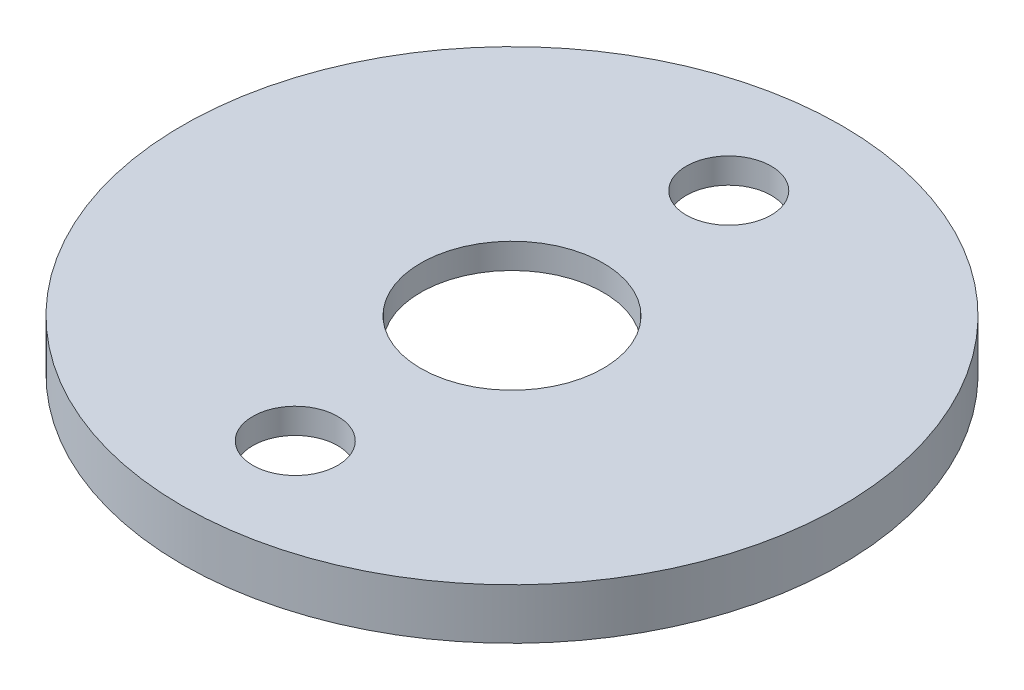
ISO-10303-21;
HEADER;
FILE_DESCRIPTION(('STEP AP214'),'2;1');
FILE_NAME('part.step','',(''),(''),'','','');
FILE_SCHEMA(('AUTOMOTIVE_DESIGN { 1 0 10303 214 1 1 1 1 }'));
ENDSEC;
DATA;
#1=APPLICATION_CONTEXT('core data for automotive mechanical design processes');
#2=APPLICATION_PROTOCOL_DEFINITION('international standard','automotive_design',2000,#1);
#3=PRODUCT_CONTEXT('',#1,'mechanical');
#4=PRODUCT('Part','Part','',(#3));
#5=PRODUCT_RELATED_PRODUCT_CATEGORY('part','',(#4));
#6=PRODUCT_DEFINITION_FORMATION('','',#4);
#7=PRODUCT_DEFINITION_CONTEXT('part definition',#1,'design');
#8=PRODUCT_DEFINITION('design','',#6,#7);
#9=PRODUCT_DEFINITION_SHAPE('','',#8);
#10=(LENGTH_UNIT() NAMED_UNIT(*) SI_UNIT(.MILLI.,.METRE.));
#11=(NAMED_UNIT(*) PLANE_ANGLE_UNIT() SI_UNIT($,.RADIAN.));
#12=(NAMED_UNIT(*) SI_UNIT($,.STERADIAN.) SOLID_ANGLE_UNIT());
#13=UNCERTAINTY_MEASURE_WITH_UNIT(LENGTH_MEASURE(1.E-05),#10,'distance_accuracy_value','');
#14=(GEOMETRIC_REPRESENTATION_CONTEXT(3) GLOBAL_UNCERTAINTY_ASSIGNED_CONTEXT((#13)) GLOBAL_UNIT_ASSIGNED_CONTEXT((#10,
#11,#12)) REPRESENTATION_CONTEXT('',''));
#15=CARTESIAN_POINT('',(0.,0.,0.));
#16=DIRECTION('',(0.,0.,1.));
#17=DIRECTION('',(1.,0.,0.));
#18=AXIS2_PLACEMENT_3D('',#15,#16,#17);
#19=CARTESIAN_POINT('',(0.,1.,0.));
#20=DIRECTION('',(0.,1.,0.));
#21=DIRECTION('',(0.,0.,1.));
#22=AXIS2_PLACEMENT_3D('',#19,#20,#21);
#23=PLANE('',#22);
#24=CARTESIAN_POINT('',(0.,1.,-8.55));
#25=DIRECTION('',(0.,1.,0.));
#26=DIRECTION('',(0.,0.,1.));
#27=AXIS2_PLACEMENT_3D('',#24,#25,#26);
#28=CIRCLE('',#27,1.675);
#29=CARTESIAN_POINT('',(0.,1.,-6.875));
#30=VERTEX_POINT('',#29);
#31=EDGE_CURVE('E50',#30,#30,#28,.T.);
#32=ORIENTED_EDGE('',*,*,#31,.F.);
#33=EDGE_LOOP('',(#32));
#34=FACE_BOUND('',#33,.T.);
#35=CARTESIAN_POINT('',(0.,1.,8.55));
#36=DIRECTION('',(0.,1.,0.));
#37=DIRECTION('',(0.,0.,1.));
#38=AXIS2_PLACEMENT_3D('',#35,#36,#37);
#39=CIRCLE('',#38,1.675);
#40=CARTESIAN_POINT('',(0.,1.,10.225));
#41=VERTEX_POINT('',#40);
#42=EDGE_CURVE('E56',#41,#41,#39,.T.);
#43=ORIENTED_EDGE('',*,*,#42,.F.);
#44=EDGE_LOOP('',(#43));
#45=FACE_BOUND('',#44,.T.);
#46=CARTESIAN_POINT('',(0.,1.,0.));
#47=DIRECTION('',(0.,1.,0.));
#48=DIRECTION('',(0.,0.,1.));
#49=AXIS2_PLACEMENT_3D('',#46,#47,#48);
#50=CIRCLE('',#49,3.6);
#51=CARTESIAN_POINT('',(0.,1.,3.6));
#52=VERTEX_POINT('',#51);
#53=EDGE_CURVE('E68',#52,#52,#50,.T.);
#54=ORIENTED_EDGE('',*,*,#53,.F.);
#55=EDGE_LOOP('',(#54));
#56=FACE_BOUND('',#55,.T.);
#57=CARTESIAN_POINT('',(0.,1.,0.));
#58=DIRECTION('',(0.,1.,0.));
#59=DIRECTION('',(0.,0.,1.));
#60=AXIS2_PLACEMENT_3D('',#57,#58,#59);
#61=CIRCLE('',#60,13.);
#62=CARTESIAN_POINT('',(0.,1.,13.));
#63=VERTEX_POINT('',#62);
#64=EDGE_CURVE('E59',#63,#63,#61,.T.);
#65=ORIENTED_EDGE('',*,*,#64,.T.);
#66=EDGE_LOOP('',(#65));
#67=FACE_BOUND('',#66,.T.);
#68=ADVANCED_FACE('F41',(#34,#45,#56,#67),#23,.T.);
#69=CARTESIAN_POINT('',(0.,0.,0.));
#70=DIRECTION('',(0.,1.,0.));
#71=DIRECTION('',(0.,0.,1.));
#72=AXIS2_PLACEMENT_3D('',#69,#70,#71);
#73=PLANE('',#72);
#74=CARTESIAN_POINT('',(0.,0.,-8.55));
#75=DIRECTION('',(0.,1.,0.));
#76=DIRECTION('',(0.,0.,1.));
#77=AXIS2_PLACEMENT_3D('',#74,#75,#76);
#78=CIRCLE('',#77,1.675);
#79=CARTESIAN_POINT('',(0.,0.,-6.875));
#80=VERTEX_POINT('',#79);
#81=EDGE_CURVE('E10',#80,#80,#78,.T.);
#82=ORIENTED_EDGE('',*,*,#81,.T.);
#83=EDGE_LOOP('',(#82));
#84=FACE_BOUND('',#83,.T.);
#85=CARTESIAN_POINT('',(0.,0.,8.55));
#86=DIRECTION('',(0.,1.,0.));
#87=DIRECTION('',(0.,0.,1.));
#88=AXIS2_PLACEMENT_3D('',#85,#86,#87);
#89=CIRCLE('',#88,1.675);
#90=CARTESIAN_POINT('',(0.,0.,10.225));
#91=VERTEX_POINT('',#90);
#92=EDGE_CURVE('E65',#91,#91,#89,.T.);
#93=ORIENTED_EDGE('',*,*,#92,.T.);
#94=EDGE_LOOP('',(#93));
#95=FACE_BOUND('',#94,.T.);
#96=CARTESIAN_POINT('',(0.,0.,0.));
#97=DIRECTION('',(0.,1.,0.));
#98=DIRECTION('',(0.,0.,1.));
#99=AXIS2_PLACEMENT_3D('',#96,#97,#98);
#100=CIRCLE('',#99,3.6);
#101=CARTESIAN_POINT('',(0.,0.,3.6));
#102=VERTEX_POINT('',#101);
#103=EDGE_CURVE('E45',#102,#102,#100,.T.);
#104=ORIENTED_EDGE('',*,*,#103,.T.);
#105=EDGE_LOOP('',(#104));
#106=FACE_BOUND('',#105,.T.);
#107=CARTESIAN_POINT('',(0.,0.,0.));
#108=DIRECTION('',(0.,-1.,0.));
#109=DIRECTION('',(0.,0.,-1.));
#110=AXIS2_PLACEMENT_3D('',#107,#108,#109);
#111=CIRCLE('',#110,12.6);
#112=CARTESIAN_POINT('',(0.,0.,-12.6));
#113=VERTEX_POINT('',#112);
#114=EDGE_CURVE('E84',#113,#113,#111,.T.);
#115=ORIENTED_EDGE('',*,*,#114,.T.);
#116=EDGE_LOOP('',(#115));
#117=FACE_BOUND('',#116,.T.);
#118=ADVANCED_FACE('F43',(#84,#95,#106,#117),#73,.F.);
#119=CARTESIAN_POINT('',(0.,0.,0.));
#120=DIRECTION('',(0.,1.,0.));
#121=DIRECTION('',(0.,0.,1.));
#122=AXIS2_PLACEMENT_3D('',#119,#120,#121);
#123=CYLINDRICAL_SURFACE('',#122,3.6);
#124=ORIENTED_EDGE('',*,*,#103,.F.);
#125=EDGE_LOOP('',(#124));
#126=FACE_BOUND('',#125,.T.);
#127=ORIENTED_EDGE('',*,*,#53,.T.);
#128=EDGE_LOOP('',(#127));
#129=FACE_BOUND('',#128,.T.);
#130=ADVANCED_FACE('F116',(#126,#129),#123,.F.);
#131=CARTESIAN_POINT('',(0.,0.,8.55));
#132=DIRECTION('',(0.,1.,0.));
#133=DIRECTION('',(0.,0.,1.));
#134=AXIS2_PLACEMENT_3D('',#131,#132,#133);
#135=CYLINDRICAL_SURFACE('',#134,1.675);
#136=ORIENTED_EDGE('',*,*,#92,.F.);
#137=EDGE_LOOP('',(#136));
#138=FACE_BOUND('',#137,.T.);
#139=ORIENTED_EDGE('',*,*,#42,.T.);
#140=EDGE_LOOP('',(#139));
#141=FACE_BOUND('',#140,.T.);
#142=ADVANCED_FACE('F122',(#138,#141),#135,.F.);
#143=CARTESIAN_POINT('',(0.,0.,-8.55));
#144=DIRECTION('',(0.,1.,0.));
#145=DIRECTION('',(0.,0.,1.));
#146=AXIS2_PLACEMENT_3D('',#143,#144,#145);
#147=CYLINDRICAL_SURFACE('',#146,1.675);
#148=ORIENTED_EDGE('',*,*,#81,.F.);
#149=EDGE_LOOP('',(#148));
#150=FACE_BOUND('',#149,.T.);
#151=ORIENTED_EDGE('',*,*,#31,.T.);
#152=EDGE_LOOP('',(#151));
#153=FACE_BOUND('',#152,.T.);
#154=ADVANCED_FACE('F109',(#150,#153),#147,.F.);
#155=CARTESIAN_POINT('',(0.,-1.,0.));
#156=DIRECTION('',(0.,1.,0.));
#157=DIRECTION('',(0.,0.,1.));
#158=AXIS2_PLACEMENT_3D('',#155,#156,#157);
#159=CYLINDRICAL_SURFACE('',#158,13.);
#160=CARTESIAN_POINT('',(0.,-1.,0.));
#161=DIRECTION('',(0.,1.,0.));
#162=DIRECTION('',(0.,0.,1.));
#163=AXIS2_PLACEMENT_3D('',#160,#161,#162);
#164=CIRCLE('',#163,13.);
#165=CARTESIAN_POINT('',(0.,-1.,13.));
#166=VERTEX_POINT('',#165);
#167=EDGE_CURVE('E75',#166,#166,#164,.T.);
#168=ORIENTED_EDGE('',*,*,#167,.T.);
#169=EDGE_LOOP('',(#168));
#170=FACE_BOUND('',#169,.T.);
#171=ORIENTED_EDGE('',*,*,#64,.F.);
#172=EDGE_LOOP('',(#171));
#173=FACE_BOUND('',#172,.T.);
#174=ADVANCED_FACE('F104',(#170,#173),#159,.T.);
#175=CARTESIAN_POINT('',(0.,-1.,0.));
#176=DIRECTION('',(0.,1.,0.));
#177=DIRECTION('',(0.,0.,1.));
#178=AXIS2_PLACEMENT_3D('',#175,#176,#177);
#179=PLANE('',#178);
#180=CARTESIAN_POINT('',(0.,-1.,0.));
#181=DIRECTION('',(0.,-1.,0.));
#182=DIRECTION('',(0.,0.,-1.));
#183=AXIS2_PLACEMENT_3D('',#180,#181,#182);
#184=CIRCLE('',#183,12.6);
#185=CARTESIAN_POINT('',(0.,-1.,-12.6));
#186=VERTEX_POINT('',#185);
#187=EDGE_CURVE('E86',#186,#186,#184,.T.);
#188=ORIENTED_EDGE('',*,*,#187,.F.);
#189=EDGE_LOOP('',(#188));
#190=FACE_BOUND('',#189,.T.);
#191=ORIENTED_EDGE('',*,*,#167,.F.);
#192=EDGE_LOOP('',(#191));
#193=FACE_BOUND('',#192,.T.);
#194=ADVANCED_FACE('F98',(#190,#193),#179,.F.);
#195=CARTESIAN_POINT('',(0.,0.,0.));
#196=DIRECTION('',(0.,-1.,0.));
#197=DIRECTION('',(0.,0.,-1.));
#198=AXIS2_PLACEMENT_3D('',#195,#196,#197);
#199=CYLINDRICAL_SURFACE('',#198,12.6);
#200=ORIENTED_EDGE('',*,*,#114,.F.);
#201=EDGE_LOOP('',(#200));
#202=FACE_BOUND('',#201,.T.);
#203=ORIENTED_EDGE('',*,*,#187,.T.);
#204=EDGE_LOOP('',(#203));
#205=FACE_BOUND('',#204,.T.);
#206=ADVANCED_FACE('F95',(#202,#205),#199,.F.);
#207=CLOSED_SHELL('',(#68,#118,#130,#142,#154,#174,#194,#206));
#208=MANIFOLD_SOLID_BREP('B2',#207);
#209=ADVANCED_BREP_SHAPE_REPRESENTATION('',(#18,#208),#14);
#210=SHAPE_DEFINITION_REPRESENTATION(#9,#209);
ENDSEC;
END-ISO-10303-21;
